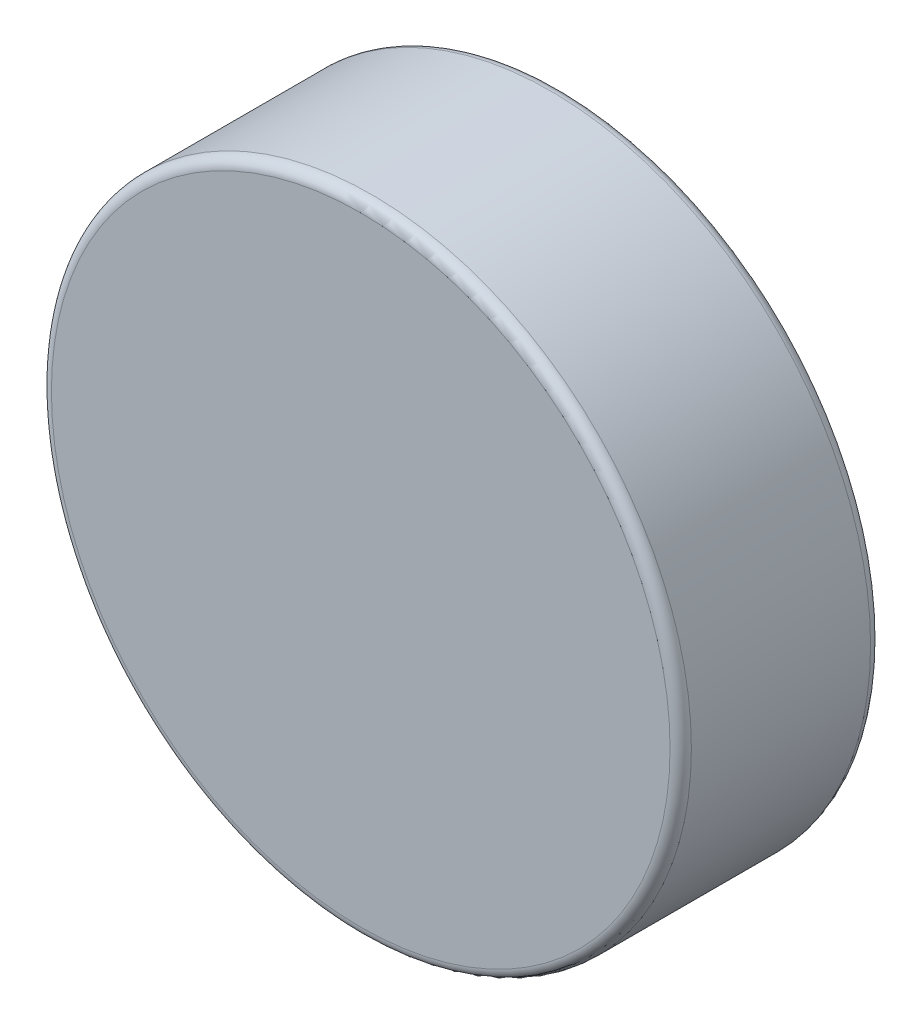
ISO-10303-21;
HEADER;
FILE_DESCRIPTION(('STEP AP214'),'2;1');
FILE_NAME('part.step','',(''),(''),'','','');
FILE_SCHEMA(('AUTOMOTIVE_DESIGN { 1 0 10303 214 1 1 1 1 }'));
ENDSEC;
DATA;
#1=APPLICATION_CONTEXT('core data for automotive mechanical design processes');
#2=APPLICATION_PROTOCOL_DEFINITION('international standard','automotive_design',2000,#1);
#3=PRODUCT_CONTEXT('',#1,'mechanical');
#4=PRODUCT('Part','Part','',(#3));
#5=PRODUCT_RELATED_PRODUCT_CATEGORY('part','',(#4));
#6=PRODUCT_DEFINITION_FORMATION('','',#4);
#7=PRODUCT_DEFINITION_CONTEXT('part definition',#1,'design');
#8=PRODUCT_DEFINITION('design','',#6,#7);
#9=PRODUCT_DEFINITION_SHAPE('','',#8);
#10=(LENGTH_UNIT() NAMED_UNIT(*) SI_UNIT(.MILLI.,.METRE.));
#11=(NAMED_UNIT(*) PLANE_ANGLE_UNIT() SI_UNIT($,.RADIAN.));
#12=(NAMED_UNIT(*) SI_UNIT($,.STERADIAN.) SOLID_ANGLE_UNIT());
#13=UNCERTAINTY_MEASURE_WITH_UNIT(LENGTH_MEASURE(1.E-05),#10,'distance_accuracy_value','');
#14=(GEOMETRIC_REPRESENTATION_CONTEXT(3) GLOBAL_UNCERTAINTY_ASSIGNED_CONTEXT((#13)) GLOBAL_UNIT_ASSIGNED_CONTEXT((#10,
#11,#12)) REPRESENTATION_CONTEXT('',''));
#15=CARTESIAN_POINT('',(0.,0.,0.));
#16=DIRECTION('',(0.,0.,1.));
#17=DIRECTION('',(1.,0.,0.));
#18=AXIS2_PLACEMENT_3D('',#15,#16,#17);
#19=CARTESIAN_POINT('',(0.,0.,1.88));
#20=DIRECTION('',(0.,0.,-1.));
#21=DIRECTION('',(-1.,0.,0.));
#22=AXIS2_PLACEMENT_3D('',#19,#20,#21);
#23=CYLINDRICAL_SURFACE('',#22,3.);
#24=CARTESIAN_POINT('',(0.,0.,0.1));
#25=DIRECTION('',(0.,0.,1.));
#26=DIRECTION('',(1.,0.,0.));
#27=AXIS2_PLACEMENT_3D('',#24,#25,#26);
#28=CIRCLE('',#27,3.);
#29=CARTESIAN_POINT('',(3.,0.,0.1));
#30=VERTEX_POINT('',#29);
#31=EDGE_CURVE('E54',#30,#30,#28,.T.);
#32=ORIENTED_EDGE('',*,*,#31,.T.);
#33=EDGE_LOOP('',(#32));
#34=FACE_BOUND('',#33,.T.);
#35=CARTESIAN_POINT('',(0.,0.,1.78));
#36=DIRECTION('',(0.,0.,1.));
#37=DIRECTION('',(1.,0.,0.));
#38=AXIS2_PLACEMENT_3D('',#35,#36,#37);
#39=CIRCLE('',#38,3.);
#40=CARTESIAN_POINT('',(3.,0.,1.78));
#41=VERTEX_POINT('',#40);
#42=EDGE_CURVE('E58',#41,#41,#39,.F.);
#43=ORIENTED_EDGE('',*,*,#42,.T.);
#44=EDGE_LOOP('',(#43));
#45=FACE_BOUND('',#44,.T.);
#46=ADVANCED_FACE('F43',(#34,#45),#23,.T.);
#47=CARTESIAN_POINT('',(0.,0.,1.88));
#48=DIRECTION('',(0.,0.,1.));
#49=DIRECTION('',(1.,0.,0.));
#50=AXIS2_PLACEMENT_3D('',#47,#48,#49);
#51=PLANE('',#50);
#52=CARTESIAN_POINT('',(0.,0.,1.88));
#53=DIRECTION('',(0.,0.,1.));
#54=DIRECTION('',(1.,0.,0.));
#55=AXIS2_PLACEMENT_3D('',#52,#53,#54);
#56=CIRCLE('',#55,2.9);
#57=CARTESIAN_POINT('',(2.9,0.,1.88));
#58=VERTEX_POINT('',#57);
#59=EDGE_CURVE('E10',#58,#58,#56,.T.);
#60=ORIENTED_EDGE('',*,*,#59,.T.);
#61=EDGE_LOOP('',(#60));
#62=FACE_BOUND('',#61,.T.);
#63=ADVANCED_FACE('F74',(#62),#51,.T.);
#64=CARTESIAN_POINT('',(0.,0.,0.));
#65=DIRECTION('',(0.,0.,1.));
#66=DIRECTION('',(1.,0.,0.));
#67=AXIS2_PLACEMENT_3D('',#64,#65,#66);
#68=PLANE('',#67);
#69=CARTESIAN_POINT('',(0.,0.,0.));
#70=DIRECTION('',(0.,0.,1.));
#71=DIRECTION('',(1.,0.,0.));
#72=AXIS2_PLACEMENT_3D('',#69,#70,#71);
#73=CIRCLE('',#72,2.9);
#74=CARTESIAN_POINT('',(2.9,0.,0.));
#75=VERTEX_POINT('',#74);
#76=EDGE_CURVE('E50',#75,#75,#73,.F.);
#77=ORIENTED_EDGE('',*,*,#76,.T.);
#78=EDGE_LOOP('',(#77));
#79=FACE_BOUND('',#78,.T.);
#80=ADVANCED_FACE('F71',(#79),#68,.F.);
#81=CARTESIAN_POINT('',(0.,0.,0.1));
#82=DIRECTION('',(0.,0.,1.));
#83=DIRECTION('',(1.,0.,0.));
#84=AXIS2_PLACEMENT_3D('',#81,#82,#83);
#85=TOROIDAL_SURFACE('',#84,2.9,0.1);
#86=ORIENTED_EDGE('',*,*,#76,.F.);
#87=EDGE_LOOP('',(#86));
#88=FACE_BOUND('',#87,.T.);
#89=ORIENTED_EDGE('',*,*,#31,.F.);
#90=EDGE_LOOP('',(#89));
#91=FACE_BOUND('',#90,.T.);
#92=ADVANCED_FACE('F67',(#88,#91),#85,.T.);
#93=CARTESIAN_POINT('',(0.,0.,1.78));
#94=DIRECTION('',(0.,0.,1.));
#95=DIRECTION('',(1.,0.,0.));
#96=AXIS2_PLACEMENT_3D('',#93,#94,#95);
#97=TOROIDAL_SURFACE('',#96,2.9,0.1);
#98=ORIENTED_EDGE('',*,*,#42,.F.);
#99=EDGE_LOOP('',(#98));
#100=FACE_BOUND('',#99,.T.);
#101=ORIENTED_EDGE('',*,*,#59,.F.);
#102=EDGE_LOOP('',(#101));
#103=FACE_BOUND('',#102,.T.);
#104=ADVANCED_FACE('F45',(#100,#103),#97,.T.);
#105=CLOSED_SHELL('',(#46,#63,#80,#92,#104));
#106=MANIFOLD_SOLID_BREP('B2',#105);
#107=ADVANCED_BREP_SHAPE_REPRESENTATION('',(#18,#106),#14);
#108=SHAPE_DEFINITION_REPRESENTATION(#9,#107);
ENDSEC;
END-ISO-10303-21;
